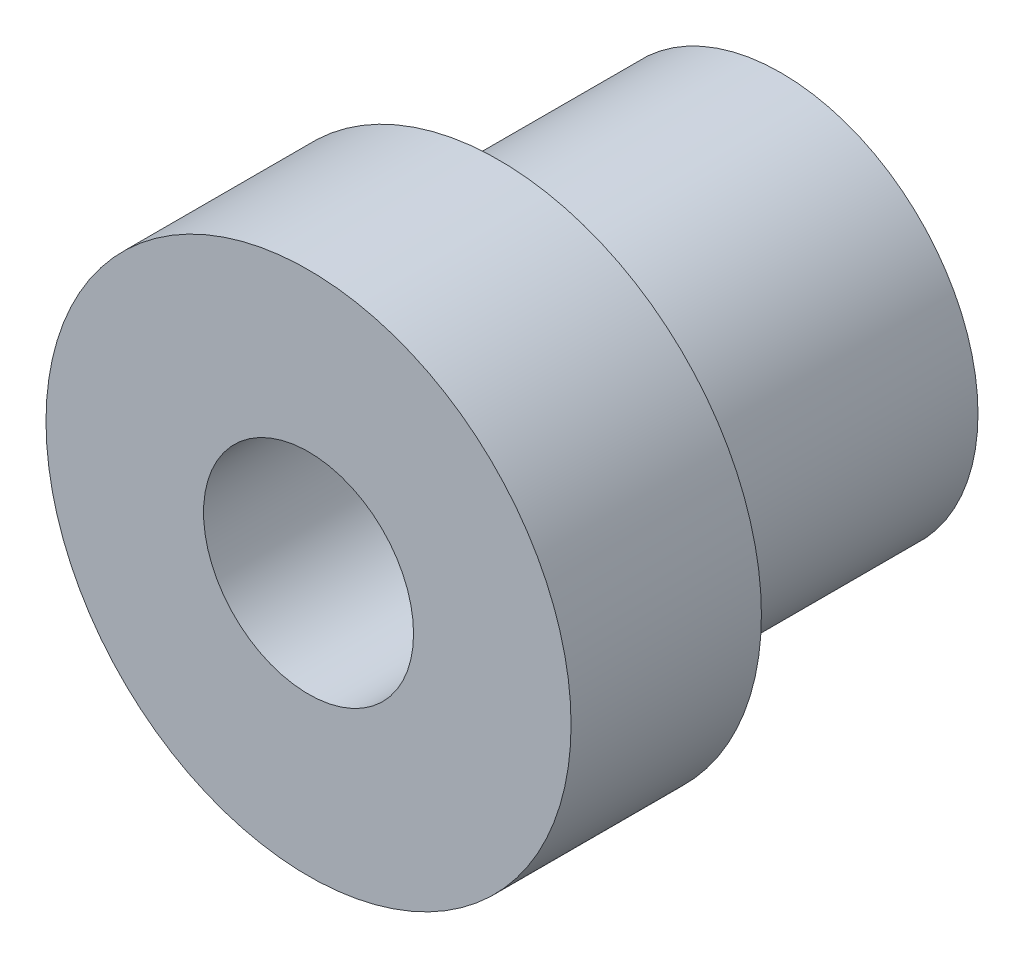
ISO-10303-21;
HEADER;
FILE_DESCRIPTION(('STEP AP214'),'2;1');
FILE_NAME('part.step','',(''),(''),'','','');
FILE_SCHEMA(('AUTOMOTIVE_DESIGN { 1 0 10303 214 1 1 1 1 }'));
ENDSEC;
DATA;
#1=APPLICATION_CONTEXT('core data for automotive mechanical design processes');
#2=APPLICATION_PROTOCOL_DEFINITION('international standard','automotive_design',2000,#1);
#3=PRODUCT_CONTEXT('',#1,'mechanical');
#4=PRODUCT('Part','Part','',(#3));
#5=PRODUCT_RELATED_PRODUCT_CATEGORY('part','',(#4));
#6=PRODUCT_DEFINITION_FORMATION('','',#4);
#7=PRODUCT_DEFINITION_CONTEXT('part definition',#1,'design');
#8=PRODUCT_DEFINITION('design','',#6,#7);
#9=PRODUCT_DEFINITION_SHAPE('','',#8);
#10=(LENGTH_UNIT() NAMED_UNIT(*) SI_UNIT(.MILLI.,.METRE.));
#11=(NAMED_UNIT(*) PLANE_ANGLE_UNIT() SI_UNIT($,.RADIAN.));
#12=(NAMED_UNIT(*) SI_UNIT($,.STERADIAN.) SOLID_ANGLE_UNIT());
#13=UNCERTAINTY_MEASURE_WITH_UNIT(LENGTH_MEASURE(1.E-05),#10,'distance_accuracy_value','');
#14=(GEOMETRIC_REPRESENTATION_CONTEXT(3) GLOBAL_UNCERTAINTY_ASSIGNED_CONTEXT((#13)) GLOBAL_UNIT_ASSIGNED_CONTEXT((#10,
#11,#12)) REPRESENTATION_CONTEXT('',''));
#15=CARTESIAN_POINT('',(0.,0.,0.));
#16=DIRECTION('',(0.,0.,1.));
#17=DIRECTION('',(1.,0.,0.));
#18=AXIS2_PLACEMENT_3D('',#15,#16,#17);
#19=CARTESIAN_POINT('',(0.,0.,0.));
#20=DIRECTION('',(0.,0.,1.));
#21=DIRECTION('',(1.,0.,0.));
#22=AXIS2_PLACEMENT_3D('',#19,#20,#21);
#23=CYLINDRICAL_SURFACE('',#22,1.6);
#24=CARTESIAN_POINT('',(0.,0.,10.));
#25=DIRECTION('',(0.,0.,1.));
#26=DIRECTION('',(1.,0.,0.));
#27=AXIS2_PLACEMENT_3D('',#24,#25,#26);
#28=CIRCLE('',#27,1.6);
#29=CARTESIAN_POINT('',(1.6,0.,10.));
#30=VERTEX_POINT('',#29);
#31=EDGE_CURVE('E45',#30,#30,#28,.T.);
#32=ORIENTED_EDGE('',*,*,#31,.T.);
#33=EDGE_LOOP('',(#32));
#34=FACE_BOUND('',#33,.T.);
#35=CARTESIAN_POINT('',(0.,0.,2.8));
#36=DIRECTION('',(0.,0.,-1.));
#37=DIRECTION('',(-1.,0.,0.));
#38=AXIS2_PLACEMENT_3D('',#35,#36,#37);
#39=CIRCLE('',#38,1.6);
#40=CARTESIAN_POINT('',(-1.6,0.,2.8));
#41=VERTEX_POINT('',#40);
#42=EDGE_CURVE('E62',#41,#41,#39,.F.);
#43=ORIENTED_EDGE('',*,*,#42,.F.);
#44=EDGE_LOOP('',(#43));
#45=FACE_BOUND('',#44,.T.);
#46=ADVANCED_FACE('F38',(#34,#45),#23,.F.);
#47=CARTESIAN_POINT('',(0.,0.,3.));
#48=DIRECTION('',(0.,0.,1.));
#49=DIRECTION('',(1.,0.,0.));
#50=AXIS2_PLACEMENT_3D('',#47,#48,#49);
#51=CYLINDRICAL_SURFACE('',#50,3.);
#52=CARTESIAN_POINT('',(0.,0.,7.1));
#53=DIRECTION('',(0.,0.,1.));
#54=DIRECTION('',(1.,0.,0.));
#55=AXIS2_PLACEMENT_3D('',#52,#53,#54);
#56=CIRCLE('',#55,3.);
#57=CARTESIAN_POINT('',(3.,0.,7.1));
#58=VERTEX_POINT('',#57);
#59=EDGE_CURVE('E56',#58,#58,#56,.T.);
#60=ORIENTED_EDGE('',*,*,#59,.F.);
#61=EDGE_LOOP('',(#60));
#62=FACE_BOUND('',#61,.T.);
#63=CARTESIAN_POINT('',(0.,0.,2.8));
#64=DIRECTION('',(0.,0.,-1.));
#65=DIRECTION('',(-1.,0.,0.));
#66=AXIS2_PLACEMENT_3D('',#63,#64,#65);
#67=CIRCLE('',#66,3.);
#68=CARTESIAN_POINT('',(-3.,0.,2.8));
#69=VERTEX_POINT('',#68);
#70=EDGE_CURVE('E65',#69,#69,#67,.T.);
#71=ORIENTED_EDGE('',*,*,#70,.F.);
#72=EDGE_LOOP('',(#71));
#73=FACE_BOUND('',#72,.T.);
#74=ADVANCED_FACE('F73',(#62,#73),#51,.T.);
#75=CARTESIAN_POINT('',(0.,0.,10.));
#76=DIRECTION('',(0.,0.,1.));
#77=DIRECTION('',(1.,0.,0.));
#78=AXIS2_PLACEMENT_3D('',#75,#76,#77);
#79=PLANE('',#78);
#80=CARTESIAN_POINT('',(0.,0.,10.));
#81=DIRECTION('',(0.,0.,1.));
#82=DIRECTION('',(1.,0.,0.));
#83=AXIS2_PLACEMENT_3D('',#80,#81,#82);
#84=CIRCLE('',#83,4.);
#85=CARTESIAN_POINT('',(4.,0.,10.));
#86=VERTEX_POINT('',#85);
#87=EDGE_CURVE('E11',#86,#86,#84,.T.);
#88=ORIENTED_EDGE('',*,*,#87,.T.);
#89=EDGE_LOOP('',(#88));
#90=FACE_BOUND('',#89,.T.);
#91=ORIENTED_EDGE('',*,*,#31,.F.);
#92=EDGE_LOOP('',(#91));
#93=FACE_BOUND('',#92,.T.);
#94=ADVANCED_FACE('F75',(#90,#93),#79,.T.);
#95=CARTESIAN_POINT('',(0.,0.,10.));
#96=DIRECTION('',(0.,0.,-1.));
#97=DIRECTION('',(-1.,0.,0.));
#98=AXIS2_PLACEMENT_3D('',#95,#96,#97);
#99=CYLINDRICAL_SURFACE('',#98,4.);
#100=CARTESIAN_POINT('',(0.,0.,7.1));
#101=DIRECTION('',(0.,0.,1.));
#102=DIRECTION('',(1.,0.,0.));
#103=AXIS2_PLACEMENT_3D('',#100,#101,#102);
#104=CIRCLE('',#103,4.);
#105=CARTESIAN_POINT('',(4.,0.,7.1));
#106=VERTEX_POINT('',#105);
#107=EDGE_CURVE('E50',#106,#106,#104,.T.);
#108=ORIENTED_EDGE('',*,*,#107,.T.);
#109=EDGE_LOOP('',(#108));
#110=FACE_BOUND('',#109,.T.);
#111=ORIENTED_EDGE('',*,*,#87,.F.);
#112=EDGE_LOOP('',(#111));
#113=FACE_BOUND('',#112,.T.);
#114=ADVANCED_FACE('F81',(#110,#113),#99,.T.);
#115=CARTESIAN_POINT('',(0.,0.,7.1));
#116=DIRECTION('',(0.,0.,1.));
#117=DIRECTION('',(1.,0.,0.));
#118=AXIS2_PLACEMENT_3D('',#115,#116,#117);
#119=PLANE('',#118);
#120=ORIENTED_EDGE('',*,*,#59,.T.);
#121=EDGE_LOOP('',(#120));
#122=FACE_BOUND('',#121,.T.);
#123=ORIENTED_EDGE('',*,*,#107,.F.);
#124=EDGE_LOOP('',(#123));
#125=FACE_BOUND('',#124,.T.);
#126=ADVANCED_FACE('F86',(#122,#125),#119,.F.);
#127=CARTESIAN_POINT('',(0.,0.,2.8));
#128=DIRECTION('',(0.,0.,-1.));
#129=DIRECTION('',(-1.,0.,0.));
#130=AXIS2_PLACEMENT_3D('',#127,#128,#129);
#131=PLANE('',#130);
#132=ORIENTED_EDGE('',*,*,#70,.T.);
#133=EDGE_LOOP('',(#132));
#134=FACE_BOUND('',#133,.T.);
#135=ORIENTED_EDGE('',*,*,#42,.T.);
#136=EDGE_LOOP('',(#135));
#137=FACE_BOUND('',#136,.T.);
#138=ADVANCED_FACE('F70',(#134,#137),#131,.T.);
#139=CLOSED_SHELL('',(#46,#74,#94,#114,#126,#138));
#140=MANIFOLD_SOLID_BREP('B2',#139);
#141=ADVANCED_BREP_SHAPE_REPRESENTATION('',(#18,#140),#14);
#142=SHAPE_DEFINITION_REPRESENTATION(#9,#141);
ENDSEC;
END-ISO-10303-21;
